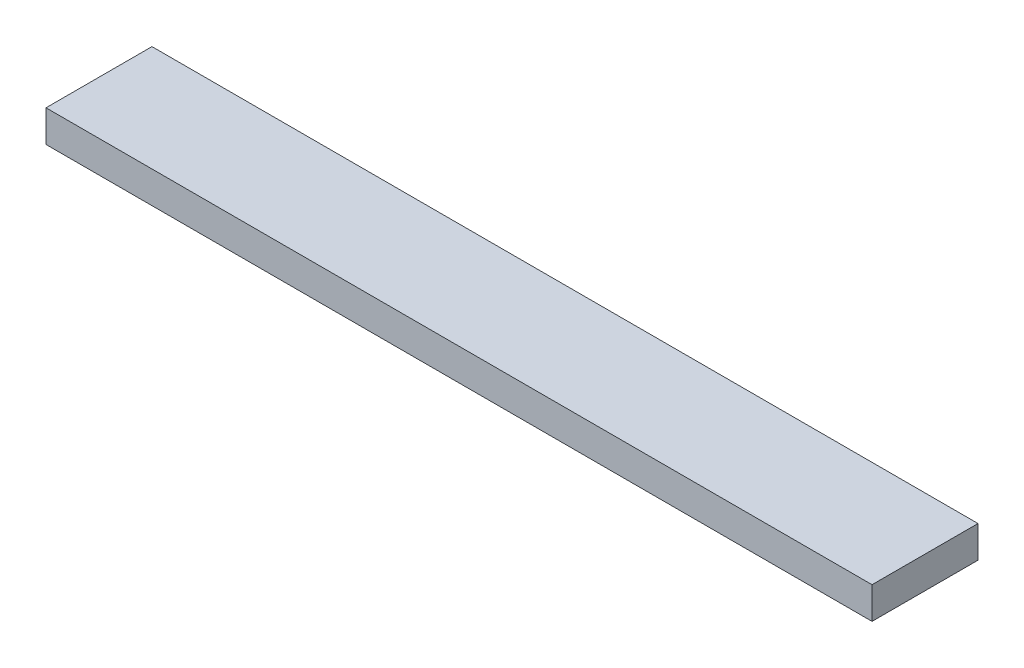
ISO-10303-21;
HEADER;
FILE_DESCRIPTION(('STEP AP214'),'2;1');
FILE_NAME('part.step','',(''),(''),'','','');
FILE_SCHEMA(('AUTOMOTIVE_DESIGN { 1 0 10303 214 1 1 1 1 }'));
ENDSEC;
DATA;
#1=APPLICATION_CONTEXT('core data for automotive mechanical design processes');
#2=APPLICATION_PROTOCOL_DEFINITION('international standard','automotive_design',2000,#1);
#3=PRODUCT_CONTEXT('',#1,'mechanical');
#4=PRODUCT('Part','Part','',(#3));
#5=PRODUCT_RELATED_PRODUCT_CATEGORY('part','',(#4));
#6=PRODUCT_DEFINITION_FORMATION('','',#4);
#7=PRODUCT_DEFINITION_CONTEXT('part definition',#1,'design');
#8=PRODUCT_DEFINITION('design','',#6,#7);
#9=PRODUCT_DEFINITION_SHAPE('','',#8);
#10=(LENGTH_UNIT() NAMED_UNIT(*) SI_UNIT(.MILLI.,.METRE.));
#11=(NAMED_UNIT(*) PLANE_ANGLE_UNIT() SI_UNIT($,.RADIAN.));
#12=(NAMED_UNIT(*) SI_UNIT($,.STERADIAN.) SOLID_ANGLE_UNIT());
#13=UNCERTAINTY_MEASURE_WITH_UNIT(LENGTH_MEASURE(1.E-05),#10,'distance_accuracy_value','');
#14=(GEOMETRIC_REPRESENTATION_CONTEXT(3) GLOBAL_UNCERTAINTY_ASSIGNED_CONTEXT((#13)) GLOBAL_UNIT_ASSIGNED_CONTEXT((#10,
#11,#12)) REPRESENTATION_CONTEXT('',''));
#15=CARTESIAN_POINT('',(0.,0.,0.));
#16=DIRECTION('',(0.,0.,1.));
#17=DIRECTION('',(1.,0.,0.));
#18=AXIS2_PLACEMENT_3D('',#15,#16,#17);
#19=CARTESIAN_POINT('',(0.,3.,0.));
#20=DIRECTION('',(1.,0.,0.));
#21=DIRECTION('',(0.,0.,-1.));
#22=AXIS2_PLACEMENT_3D('',#19,#20,#21);
#23=PLANE('',#22);
#24=DIRECTION('',(0.,0.,1.));
#25=VECTOR('',#24,1.);
#26=CARTESIAN_POINT('',(0.,0.,0.));
#27=LINE('',#26,#25);
#28=CARTESIAN_POINT('',(0.,0.,-10.));
#29=VERTEX_POINT('',#28);
#30=CARTESIAN_POINT('',(0.,0.,0.));
#31=VERTEX_POINT('',#30);
#32=EDGE_CURVE('E111',#29,#31,#27,.T.);
#33=ORIENTED_EDGE('',*,*,#32,.T.);
#34=DIRECTION('',(0.,-1.,0.));
#35=VECTOR('',#34,1.);
#36=CARTESIAN_POINT('',(0.,3.,0.));
#37=LINE('',#36,#35);
#38=CARTESIAN_POINT('',(0.,3.,0.));
#39=VERTEX_POINT('',#38);
#40=EDGE_CURVE('E11',#39,#31,#37,.T.);
#41=ORIENTED_EDGE('',*,*,#40,.F.);
#42=DIRECTION('',(0.,0.,1.));
#43=VECTOR('',#42,1.);
#44=CARTESIAN_POINT('',(0.,3.,0.));
#45=LINE('',#44,#43);
#46=CARTESIAN_POINT('',(0.,3.,-10.));
#47=VERTEX_POINT('',#46);
#48=EDGE_CURVE('E95',#47,#39,#45,.T.);
#49=ORIENTED_EDGE('',*,*,#48,.F.);
#50=DIRECTION('',(0.,-1.,0.));
#51=VECTOR('',#50,1.);
#52=CARTESIAN_POINT('',(0.,3.,-10.));
#53=LINE('',#52,#51);
#54=EDGE_CURVE('E107',#47,#29,#53,.T.);
#55=ORIENTED_EDGE('',*,*,#54,.T.);
#56=EDGE_LOOP('',(#33,#41,#49,#55));
#57=FACE_BOUND('',#56,.T.);
#58=ADVANCED_FACE('F43',(#57),#23,.F.);
#59=CARTESIAN_POINT('',(0.,3.,0.));
#60=DIRECTION('',(0.,0.,-1.));
#61=DIRECTION('',(-1.,0.,0.));
#62=AXIS2_PLACEMENT_3D('',#59,#60,#61);
#63=PLANE('',#62);
#64=DIRECTION('',(1.,0.,0.));
#65=VECTOR('',#64,1.);
#66=CARTESIAN_POINT('',(0.,0.,0.));
#67=LINE('',#66,#65);
#68=CARTESIAN_POINT('',(77.95,0.,0.));
#69=VERTEX_POINT('',#68);
#70=EDGE_CURVE('E100',#31,#69,#67,.T.);
#71=ORIENTED_EDGE('',*,*,#70,.T.);
#72=DIRECTION('',(0.,-1.,0.));
#73=VECTOR('',#72,1.);
#74=CARTESIAN_POINT('',(77.95,3.,0.));
#75=LINE('',#74,#73);
#76=CARTESIAN_POINT('',(77.95,3.,0.));
#77=VERTEX_POINT('',#76);
#78=EDGE_CURVE('E52',#77,#69,#75,.T.);
#79=ORIENTED_EDGE('',*,*,#78,.F.);
#80=DIRECTION('',(1.,0.,0.));
#81=VECTOR('',#80,1.);
#82=CARTESIAN_POINT('',(0.,3.,0.));
#83=LINE('',#82,#81);
#84=EDGE_CURVE('E90',#39,#77,#83,.T.);
#85=ORIENTED_EDGE('',*,*,#84,.F.);
#86=ORIENTED_EDGE('',*,*,#40,.T.);
#87=EDGE_LOOP('',(#71,#79,#85,#86));
#88=FACE_BOUND('',#87,.T.);
#89=ADVANCED_FACE('F99',(#88),#63,.F.);
#90=CARTESIAN_POINT('',(77.95,3.,0.));
#91=DIRECTION('',(-1.,0.,0.));
#92=DIRECTION('',(0.,0.,1.));
#93=AXIS2_PLACEMENT_3D('',#90,#91,#92);
#94=PLANE('',#93);
#95=DIRECTION('',(0.,0.,-1.));
#96=VECTOR('',#95,1.);
#97=CARTESIAN_POINT('',(77.95,0.,0.));
#98=LINE('',#97,#96);
#99=CARTESIAN_POINT('',(77.95,0.,-10.));
#100=VERTEX_POINT('',#99);
#101=EDGE_CURVE('E77',#69,#100,#98,.T.);
#102=ORIENTED_EDGE('',*,*,#101,.T.);
#103=DIRECTION('',(0.,-1.,0.));
#104=VECTOR('',#103,1.);
#105=CARTESIAN_POINT('',(77.95,3.,-10.));
#106=LINE('',#105,#104);
#107=CARTESIAN_POINT('',(77.95,3.,-10.));
#108=VERTEX_POINT('',#107);
#109=EDGE_CURVE('E102',#108,#100,#106,.T.);
#110=ORIENTED_EDGE('',*,*,#109,.F.);
#111=DIRECTION('',(0.,0.,-1.));
#112=VECTOR('',#111,1.);
#113=CARTESIAN_POINT('',(77.95,3.,0.));
#114=LINE('',#113,#112);
#115=EDGE_CURVE('E93',#77,#108,#114,.T.);
#116=ORIENTED_EDGE('',*,*,#115,.F.);
#117=ORIENTED_EDGE('',*,*,#78,.T.);
#118=EDGE_LOOP('',(#102,#110,#116,#117));
#119=FACE_BOUND('',#118,.T.);
#120=ADVANCED_FACE('F103',(#119),#94,.F.);
#121=CARTESIAN_POINT('',(0.,3.,-10.));
#122=DIRECTION('',(0.,0.,1.));
#123=DIRECTION('',(1.,0.,0.));
#124=AXIS2_PLACEMENT_3D('',#121,#122,#123);
#125=PLANE('',#124);
#126=DIRECTION('',(-1.,0.,0.));
#127=VECTOR('',#126,1.);
#128=CARTESIAN_POINT('',(0.,0.,-10.));
#129=LINE('',#128,#127);
#130=EDGE_CURVE('E83',#100,#29,#129,.T.);
#131=ORIENTED_EDGE('',*,*,#130,.T.);
#132=ORIENTED_EDGE('',*,*,#54,.F.);
#133=DIRECTION('',(-1.,0.,0.));
#134=VECTOR('',#133,1.);
#135=CARTESIAN_POINT('',(0.,3.,-10.));
#136=LINE('',#135,#134);
#137=EDGE_CURVE('E60',#108,#47,#136,.T.);
#138=ORIENTED_EDGE('',*,*,#137,.F.);
#139=ORIENTED_EDGE('',*,*,#109,.T.);
#140=EDGE_LOOP('',(#131,#132,#138,#139));
#141=FACE_BOUND('',#140,.T.);
#142=ADVANCED_FACE('F124',(#141),#125,.F.);
#143=CARTESIAN_POINT('',(0.,3.,0.));
#144=DIRECTION('',(0.,-1.,0.));
#145=DIRECTION('',(0.,0.,-1.));
#146=AXIS2_PLACEMENT_3D('',#143,#144,#145);
#147=PLANE('',#146);
#148=ORIENTED_EDGE('',*,*,#48,.T.);
#149=ORIENTED_EDGE('',*,*,#84,.T.);
#150=ORIENTED_EDGE('',*,*,#115,.T.);
#151=ORIENTED_EDGE('',*,*,#137,.T.);
#152=EDGE_LOOP('',(#148,#149,#150,#151));
#153=FACE_BOUND('',#152,.T.);
#154=ADVANCED_FACE('F91',(#153),#147,.F.);
#155=CARTESIAN_POINT('',(0.,0.,0.));
#156=DIRECTION('',(0.,-1.,0.));
#157=DIRECTION('',(0.,0.,-1.));
#158=AXIS2_PLACEMENT_3D('',#155,#156,#157);
#159=PLANE('',#158);
#160=ORIENTED_EDGE('',*,*,#32,.F.);
#161=ORIENTED_EDGE('',*,*,#130,.F.);
#162=ORIENTED_EDGE('',*,*,#101,.F.);
#163=ORIENTED_EDGE('',*,*,#70,.F.);
#164=EDGE_LOOP('',(#160,#161,#162,#163));
#165=FACE_BOUND('',#164,.T.);
#166=ADVANCED_FACE('F127',(#165),#159,.T.);
#167=CLOSED_SHELL('',(#58,#89,#120,#142,#154,#166));
#168=MANIFOLD_SOLID_BREP('B2',#167);
#169=ADVANCED_BREP_SHAPE_REPRESENTATION('',(#18,#168),#14);
#170=SHAPE_DEFINITION_REPRESENTATION(#9,#169);
ENDSEC;
END-ISO-10303-21;
